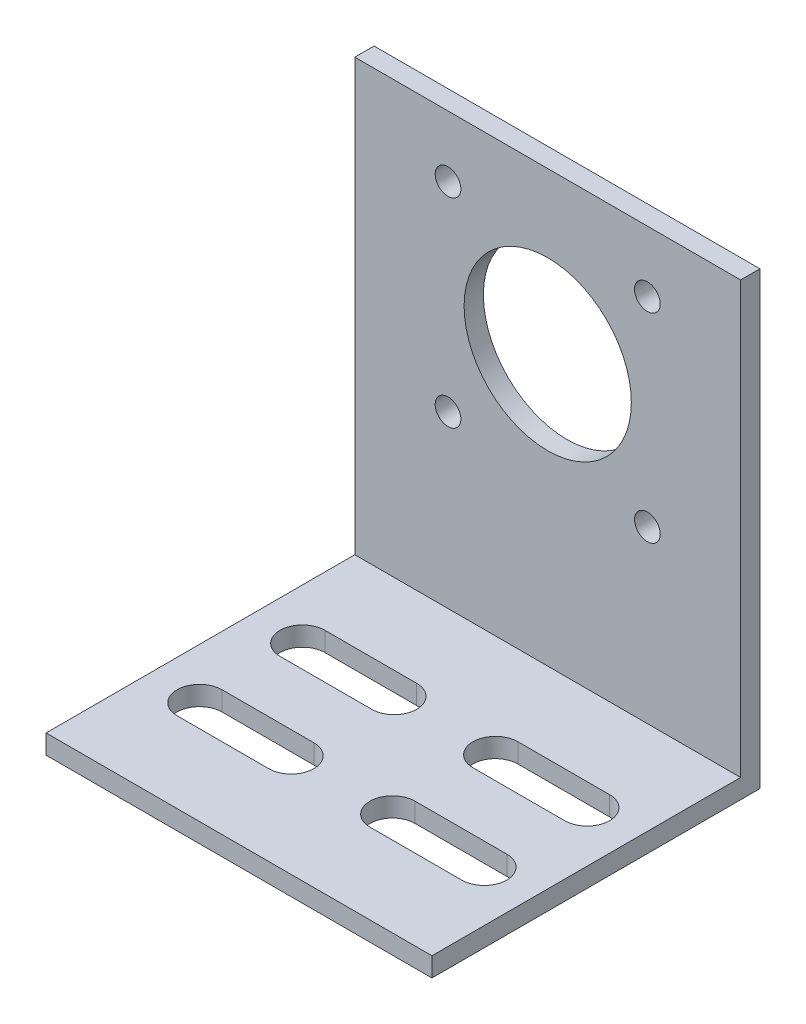
ISO-10303-21;
HEADER;
FILE_DESCRIPTION(('STEP AP214'),'2;1');
FILE_NAME('part.step','',(''),(''),'','','');
FILE_SCHEMA(('AUTOMOTIVE_DESIGN { 1 0 10303 214 1 1 1 1 }'));
ENDSEC;
DATA;
#1=APPLICATION_CONTEXT('core data for automotive mechanical design processes');
#2=APPLICATION_PROTOCOL_DEFINITION('international standard','automotive_design',2000,#1);
#3=PRODUCT_CONTEXT('',#1,'mechanical');
#4=PRODUCT('Part','Part','',(#3));
#5=PRODUCT_RELATED_PRODUCT_CATEGORY('part','',(#4));
#6=PRODUCT_DEFINITION_FORMATION('','',#4);
#7=PRODUCT_DEFINITION_CONTEXT('part definition',#1,'design');
#8=PRODUCT_DEFINITION('design','',#6,#7);
#9=PRODUCT_DEFINITION_SHAPE('','',#8);
#10=(LENGTH_UNIT() NAMED_UNIT(*) SI_UNIT(.MILLI.,.METRE.));
#11=(NAMED_UNIT(*) PLANE_ANGLE_UNIT() SI_UNIT($,.RADIAN.));
#12=(NAMED_UNIT(*) SI_UNIT($,.STERADIAN.) SOLID_ANGLE_UNIT());
#13=UNCERTAINTY_MEASURE_WITH_UNIT(LENGTH_MEASURE(1.E-05),#10,'distance_accuracy_value','');
#14=(GEOMETRIC_REPRESENTATION_CONTEXT(3) GLOBAL_UNCERTAINTY_ASSIGNED_CONTEXT((#13)) GLOBAL_UNIT_ASSIGNED_CONTEXT((#10,
#11,#12)) REPRESENTATION_CONTEXT('',''));
#15=CARTESIAN_POINT('',(0.,0.,0.));
#16=DIRECTION('',(0.,0.,1.));
#17=DIRECTION('',(1.,0.,0.));
#18=AXIS2_PLACEMENT_3D('',#15,#16,#17);
#19=CARTESIAN_POINT('',(-30.,-44.5,3.));
#20=DIRECTION('',(0.,1.,0.));
#21=DIRECTION('',(0.,0.,1.));
#22=AXIS2_PLACEMENT_3D('',#19,#20,#21);
#23=PLANE('',#22);
#24=DIRECTION('',(-1.,0.,0.));
#25=VECTOR('',#24,1.);
#26=CARTESIAN_POINT('',(-30.,-44.5,31.5));
#27=LINE('',#26,#25);
#28=CARTESIAN_POINT('',(22.1320374589651,-44.5,31.5));
#29=VERTEX_POINT('',#28);
#30=CARTESIAN_POINT('',(7.86796254103491,-44.5,31.5));
#31=VERTEX_POINT('',#30);
#32=EDGE_CURVE('E216',#29,#31,#27,.T.);
#33=ORIENTED_EDGE('',*,*,#32,.T.);
#34=CARTESIAN_POINT('',(7.86796254103491,-44.5,35.));
#35=DIRECTION('',(0.,1.,0.));
#36=DIRECTION('',(0.,0.,1.));
#37=AXIS2_PLACEMENT_3D('',#34,#35,#36);
#38=CIRCLE('',#37,3.5);
#39=CARTESIAN_POINT('',(7.86796254103491,-44.5,38.5));
#40=VERTEX_POINT('',#39);
#41=EDGE_CURVE('E219',#31,#40,#38,.T.);
#42=ORIENTED_EDGE('',*,*,#41,.T.);
#43=DIRECTION('',(1.,0.,0.));
#44=VECTOR('',#43,1.);
#45=CARTESIAN_POINT('',(-30.,-44.5,38.5));
#46=LINE('',#45,#44);
#47=CARTESIAN_POINT('',(22.1320374589651,-44.5,38.5));
#48=VERTEX_POINT('',#47);
#49=EDGE_CURVE('E211',#40,#48,#46,.T.);
#50=ORIENTED_EDGE('',*,*,#49,.T.);
#51=CARTESIAN_POINT('',(22.1320374589651,-44.5,35.));
#52=DIRECTION('',(0.,1.,0.));
#53=DIRECTION('',(0.,0.,1.));
#54=AXIS2_PLACEMENT_3D('',#51,#52,#53);
#55=CIRCLE('',#54,3.5);
#56=EDGE_CURVE('E191',#48,#29,#55,.T.);
#57=ORIENTED_EDGE('',*,*,#56,.T.);
#58=EDGE_LOOP('',(#33,#42,#50,#57));
#59=FACE_BOUND('',#58,.T.);
#60=CARTESIAN_POINT('',(-7.86796254103491,-44.5,35.));
#61=DIRECTION('',(0.,1.,0.));
#62=DIRECTION('',(0.,0.,1.));
#63=AXIS2_PLACEMENT_3D('',#60,#61,#62);
#64=CIRCLE('',#63,3.5);
#65=CARTESIAN_POINT('',(-7.86796254103491,-44.5,31.5));
#66=VERTEX_POINT('',#65);
#67=CARTESIAN_POINT('',(-7.86796254103491,-44.5,38.5));
#68=VERTEX_POINT('',#67);
#69=EDGE_CURVE('E280',#66,#68,#64,.F.);
#70=ORIENTED_EDGE('',*,*,#69,.F.);
#71=DIRECTION('',(1.,0.,0.));
#72=VECTOR('',#71,1.);
#73=CARTESIAN_POINT('',(-30.,-44.5,31.5));
#74=LINE('',#73,#72);
#75=CARTESIAN_POINT('',(-22.1320374589651,-44.5,31.5));
#76=VERTEX_POINT('',#75);
#77=EDGE_CURVE('E267',#76,#66,#74,.T.);
#78=ORIENTED_EDGE('',*,*,#77,.F.);
#79=CARTESIAN_POINT('',(-22.1320374589651,-44.5,35.));
#80=DIRECTION('',(0.,1.,0.));
#81=DIRECTION('',(0.,0.,1.));
#82=AXIS2_PLACEMENT_3D('',#79,#80,#81);
#83=CIRCLE('',#82,3.5);
#84=CARTESIAN_POINT('',(-22.1320374589651,-44.5,38.5));
#85=VERTEX_POINT('',#84);
#86=EDGE_CURVE('E275',#85,#76,#83,.F.);
#87=ORIENTED_EDGE('',*,*,#86,.F.);
#88=DIRECTION('',(-1.,0.,0.));
#89=VECTOR('',#88,1.);
#90=CARTESIAN_POINT('',(-30.,-44.5,38.5));
#91=LINE('',#90,#89);
#92=EDGE_CURVE('E278',#68,#85,#91,.T.);
#93=ORIENTED_EDGE('',*,*,#92,.F.);
#94=EDGE_LOOP('',(#70,#78,#87,#93));
#95=FACE_BOUND('',#94,.T.);
#96=DIRECTION('',(1.,0.,0.));
#97=VECTOR('',#96,1.);
#98=CARTESIAN_POINT('',(-30.,-44.5,22.5));
#99=LINE('',#98,#97);
#100=CARTESIAN_POINT('',(-22.1320374589651,-44.5,22.5));
#101=VERTEX_POINT('',#100);
#102=CARTESIAN_POINT('',(-7.86796254103491,-44.5,22.5));
#103=VERTEX_POINT('',#102);
#104=EDGE_CURVE('E308',#101,#103,#99,.T.);
#105=ORIENTED_EDGE('',*,*,#104,.T.);
#106=CARTESIAN_POINT('',(-7.86796254103491,-44.5,19.));
#107=DIRECTION('',(0.,1.,0.));
#108=DIRECTION('',(0.,0.,1.));
#109=AXIS2_PLACEMENT_3D('',#106,#107,#108);
#110=CIRCLE('',#109,3.5);
#111=CARTESIAN_POINT('',(-7.86796254103491,-44.5,15.5));
#112=VERTEX_POINT('',#111);
#113=EDGE_CURVE('E311',#103,#112,#110,.T.);
#114=ORIENTED_EDGE('',*,*,#113,.T.);
#115=DIRECTION('',(-1.,0.,0.));
#116=VECTOR('',#115,1.);
#117=CARTESIAN_POINT('',(-30.,-44.5,15.5));
#118=LINE('',#117,#116);
#119=CARTESIAN_POINT('',(-22.1320374589651,-44.5,15.5));
#120=VERTEX_POINT('',#119);
#121=EDGE_CURVE('E296',#112,#120,#118,.T.);
#122=ORIENTED_EDGE('',*,*,#121,.T.);
#123=CARTESIAN_POINT('',(-22.1320374589651,-44.5,19.));
#124=DIRECTION('',(0.,1.,0.));
#125=DIRECTION('',(0.,0.,1.));
#126=AXIS2_PLACEMENT_3D('',#123,#124,#125);
#127=CIRCLE('',#126,3.5);
#128=EDGE_CURVE('E305',#120,#101,#127,.T.);
#129=ORIENTED_EDGE('',*,*,#128,.T.);
#130=EDGE_LOOP('',(#105,#114,#122,#129));
#131=FACE_BOUND('',#130,.T.);
#132=DIRECTION('',(1.,0.,0.));
#133=VECTOR('',#132,1.);
#134=CARTESIAN_POINT('',(-30.,-44.5,0.));
#135=LINE('',#134,#133);
#136=CARTESIAN_POINT('',(-30.,-44.5,0.));
#137=VERTEX_POINT('',#136);
#138=CARTESIAN_POINT('',(30.,-44.5,0.));
#139=VERTEX_POINT('',#138);
#140=EDGE_CURVE('E359',#137,#139,#135,.T.);
#141=ORIENTED_EDGE('',*,*,#140,.T.);
#142=DIRECTION('',(0.,0.,-1.));
#143=VECTOR('',#142,1.);
#144=CARTESIAN_POINT('',(30.,-44.5,3.));
#145=LINE('',#144,#143);
#146=CARTESIAN_POINT('',(30.,-44.5,51.));
#147=VERTEX_POINT('',#146);
#148=EDGE_CURVE('E363',#147,#139,#145,.T.);
#149=ORIENTED_EDGE('',*,*,#148,.F.);
#150=DIRECTION('',(-1.,0.,0.));
#151=VECTOR('',#150,1.);
#152=CARTESIAN_POINT('',(-30.,-44.5,51.));
#153=LINE('',#152,#151);
#154=CARTESIAN_POINT('',(-30.,-44.5,51.));
#155=VERTEX_POINT('',#154);
#156=EDGE_CURVE('E333',#147,#155,#153,.T.);
#157=ORIENTED_EDGE('',*,*,#156,.T.);
#158=DIRECTION('',(0.,0.,-1.));
#159=VECTOR('',#158,1.);
#160=CARTESIAN_POINT('',(-30.,-44.5,3.));
#161=LINE('',#160,#159);
#162=EDGE_CURVE('E372',#155,#137,#161,.T.);
#163=ORIENTED_EDGE('',*,*,#162,.T.);
#164=EDGE_LOOP('',(#141,#149,#157,#163));
#165=FACE_BOUND('',#164,.T.);
#166=CARTESIAN_POINT('',(7.86796254103491,-44.5,19.));
#167=DIRECTION('',(0.,1.,0.));
#168=DIRECTION('',(0.,0.,1.));
#169=AXIS2_PLACEMENT_3D('',#166,#167,#168);
#170=CIRCLE('',#169,3.5);
#171=CARTESIAN_POINT('',(7.86796254103491,-44.5,22.5));
#172=VERTEX_POINT('',#171);
#173=CARTESIAN_POINT('',(7.86796254103491,-44.5,15.5));
#174=VERTEX_POINT('',#173);
#175=EDGE_CURVE('E250',#172,#174,#170,.F.);
#176=ORIENTED_EDGE('',*,*,#175,.F.);
#177=DIRECTION('',(-1.,0.,0.));
#178=VECTOR('',#177,1.);
#179=CARTESIAN_POINT('',(-30.,-44.5,22.5));
#180=LINE('',#179,#178);
#181=CARTESIAN_POINT('',(22.1320374589651,-44.5,22.5));
#182=VERTEX_POINT('',#181);
#183=EDGE_CURVE('E237',#182,#172,#180,.T.);
#184=ORIENTED_EDGE('',*,*,#183,.F.);
#185=CARTESIAN_POINT('',(22.1320374589651,-44.5,19.));
#186=DIRECTION('',(0.,1.,0.));
#187=DIRECTION('',(0.,0.,1.));
#188=AXIS2_PLACEMENT_3D('',#185,#186,#187);
#189=CIRCLE('',#188,3.5);
#190=CARTESIAN_POINT('',(22.1320374589651,-44.5,15.5));
#191=VERTEX_POINT('',#190);
#192=EDGE_CURVE('E245',#191,#182,#189,.F.);
#193=ORIENTED_EDGE('',*,*,#192,.F.);
#194=DIRECTION('',(1.,0.,0.));
#195=VECTOR('',#194,1.);
#196=CARTESIAN_POINT('',(-30.,-44.5,15.5));
#197=LINE('',#196,#195);
#198=EDGE_CURVE('E248',#174,#191,#197,.T.);
#199=ORIENTED_EDGE('',*,*,#198,.F.);
#200=EDGE_LOOP('',(#176,#184,#193,#199));
#201=FACE_BOUND('',#200,.T.);
#202=ADVANCED_FACE('F34',(#59,#95,#131,#165,#201),#23,.F.);
#203=CARTESIAN_POINT('',(0.,-41.5,0.));
#204=DIRECTION('',(0.,1.,0.));
#205=DIRECTION('',(0.,0.,1.));
#206=AXIS2_PLACEMENT_3D('',#203,#204,#205);
#207=PLANE('',#206);
#208=CARTESIAN_POINT('',(7.86796254103491,-41.5,35.));
#209=DIRECTION('',(0.,1.,0.));
#210=DIRECTION('',(0.,0.,-1.));
#211=AXIS2_PLACEMENT_3D('',#208,#209,#210);
#212=CIRCLE('',#211,3.5);
#213=CARTESIAN_POINT('',(7.86796254103491,-41.5,31.5));
#214=VERTEX_POINT('',#213);
#215=CARTESIAN_POINT('',(7.86796254103491,-41.5,38.5));
#216=VERTEX_POINT('',#215);
#217=EDGE_CURVE('E59',#214,#216,#212,.T.);
#218=ORIENTED_EDGE('',*,*,#217,.F.);
#219=DIRECTION('',(-1.,0.,0.));
#220=VECTOR('',#219,1.);
#221=CARTESIAN_POINT('',(22.1320374589651,-41.5,31.5));
#222=LINE('',#221,#220);
#223=CARTESIAN_POINT('',(22.1320374589651,-41.5,31.5));
#224=VERTEX_POINT('',#223);
#225=EDGE_CURVE('E204',#224,#214,#222,.T.);
#226=ORIENTED_EDGE('',*,*,#225,.F.);
#227=CARTESIAN_POINT('',(22.1320374589651,-41.5,35.));
#228=DIRECTION('',(0.,1.,0.));
#229=DIRECTION('',(0.,0.,-1.));
#230=AXIS2_PLACEMENT_3D('',#227,#228,#229);
#231=CIRCLE('',#230,3.5);
#232=CARTESIAN_POINT('',(22.1320374589651,-41.5,38.5));
#233=VERTEX_POINT('',#232);
#234=EDGE_CURVE('E188',#233,#224,#231,.T.);
#235=ORIENTED_EDGE('',*,*,#234,.F.);
#236=DIRECTION('',(1.,0.,0.));
#237=VECTOR('',#236,1.);
#238=CARTESIAN_POINT('',(22.1320374589651,-41.5,38.5));
#239=LINE('',#238,#237);
#240=EDGE_CURVE('E197',#216,#233,#239,.T.);
#241=ORIENTED_EDGE('',*,*,#240,.F.);
#242=EDGE_LOOP('',(#218,#226,#235,#241));
#243=FACE_BOUND('',#242,.T.);
#244=CARTESIAN_POINT('',(-7.86796254103491,-41.5,19.));
#245=DIRECTION('',(0.,1.,0.));
#246=DIRECTION('',(0.,0.,1.));
#247=AXIS2_PLACEMENT_3D('',#244,#245,#246);
#248=CIRCLE('',#247,3.5);
#249=CARTESIAN_POINT('',(-7.86796254103491,-41.5,22.5));
#250=VERTEX_POINT('',#249);
#251=CARTESIAN_POINT('',(-7.86796254103491,-41.5,15.5));
#252=VERTEX_POINT('',#251);
#253=EDGE_CURVE('E282',#250,#252,#248,.T.);
#254=ORIENTED_EDGE('',*,*,#253,.F.);
#255=DIRECTION('',(1.,0.,0.));
#256=VECTOR('',#255,1.);
#257=CARTESIAN_POINT('',(-22.1320374589651,-41.5,22.5));
#258=LINE('',#257,#256);
#259=CARTESIAN_POINT('',(-22.1320374589651,-41.5,22.5));
#260=VERTEX_POINT('',#259);
#261=EDGE_CURVE('E290',#260,#250,#258,.T.);
#262=ORIENTED_EDGE('',*,*,#261,.F.);
#263=CARTESIAN_POINT('',(-22.1320374589651,-41.5,19.));
#264=DIRECTION('',(0.,1.,0.));
#265=DIRECTION('',(0.,0.,1.));
#266=AXIS2_PLACEMENT_3D('',#263,#264,#265);
#267=CIRCLE('',#266,3.5);
#268=CARTESIAN_POINT('',(-22.1320374589651,-41.5,15.5));
#269=VERTEX_POINT('',#268);
#270=EDGE_CURVE('E287',#269,#260,#267,.T.);
#271=ORIENTED_EDGE('',*,*,#270,.F.);
#272=DIRECTION('',(-1.,0.,0.));
#273=VECTOR('',#272,1.);
#274=CARTESIAN_POINT('',(-22.1320374589651,-41.5,15.5));
#275=LINE('',#274,#273);
#276=EDGE_CURVE('E284',#252,#269,#275,.T.);
#277=ORIENTED_EDGE('',*,*,#276,.F.);
#278=EDGE_LOOP('',(#254,#262,#271,#277));
#279=FACE_BOUND('',#278,.T.);
#280=DIRECTION('',(0.,0.,1.));
#281=VECTOR('',#280,1.);
#282=CARTESIAN_POINT('',(30.,-41.5,0.));
#283=LINE('',#282,#281);
#284=CARTESIAN_POINT('',(30.,-41.5,3.));
#285=VERTEX_POINT('',#284);
#286=CARTESIAN_POINT('',(30.,-41.5,51.));
#287=VERTEX_POINT('',#286);
#288=EDGE_CURVE('E332',#285,#287,#283,.T.);
#289=ORIENTED_EDGE('',*,*,#288,.F.);
#290=DIRECTION('',(-1.,0.,0.));
#291=VECTOR('',#290,1.);
#292=CARTESIAN_POINT('',(0.,-41.5,3.));
#293=LINE('',#292,#291);
#294=CARTESIAN_POINT('',(-30.,-41.5,3.));
#295=VERTEX_POINT('',#294);
#296=EDGE_CURVE('E344',#285,#295,#293,.T.);
#297=ORIENTED_EDGE('',*,*,#296,.T.);
#298=DIRECTION('',(0.,0.,-1.));
#299=VECTOR('',#298,1.);
#300=CARTESIAN_POINT('',(-30.,-41.5,0.));
#301=LINE('',#300,#299);
#302=CARTESIAN_POINT('',(-30.,-41.5,51.));
#303=VERTEX_POINT('',#302);
#304=EDGE_CURVE('E329',#303,#295,#301,.T.);
#305=ORIENTED_EDGE('',*,*,#304,.F.);
#306=DIRECTION('',(-1.,0.,0.));
#307=VECTOR('',#306,1.);
#308=CARTESIAN_POINT('',(-30.,-41.5,51.));
#309=LINE('',#308,#307);
#310=EDGE_CURVE('E335',#287,#303,#309,.T.);
#311=ORIENTED_EDGE('',*,*,#310,.F.);
#312=EDGE_LOOP('',(#289,#297,#305,#311));
#313=FACE_BOUND('',#312,.T.);
#314=DIRECTION('',(1.,0.,0.));
#315=VECTOR('',#314,1.);
#316=CARTESIAN_POINT('',(-22.1320374589651,-41.5,31.5));
#317=LINE('',#316,#315);
#318=CARTESIAN_POINT('',(-22.1320374589651,-41.5,31.5));
#319=VERTEX_POINT('',#318);
#320=CARTESIAN_POINT('',(-7.86796254103491,-41.5,31.5));
#321=VERTEX_POINT('',#320);
#322=EDGE_CURVE('E255',#319,#321,#317,.T.);
#323=ORIENTED_EDGE('',*,*,#322,.T.);
#324=CARTESIAN_POINT('',(-7.86796254103491,-41.5,35.));
#325=DIRECTION('',(0.,-1.,0.));
#326=DIRECTION('',(0.,0.,-1.));
#327=AXIS2_PLACEMENT_3D('',#324,#325,#326);
#328=CIRCLE('',#327,3.5);
#329=CARTESIAN_POINT('',(-7.86796254103491,-41.5,38.5));
#330=VERTEX_POINT('',#329);
#331=EDGE_CURVE('E252',#321,#330,#328,.T.);
#332=ORIENTED_EDGE('',*,*,#331,.T.);
#333=DIRECTION('',(-1.,0.,0.));
#334=VECTOR('',#333,1.);
#335=CARTESIAN_POINT('',(-22.1320374589651,-41.5,38.5));
#336=LINE('',#335,#334);
#337=CARTESIAN_POINT('',(-22.1320374589651,-41.5,38.5));
#338=VERTEX_POINT('',#337);
#339=EDGE_CURVE('E261',#330,#338,#336,.T.);
#340=ORIENTED_EDGE('',*,*,#339,.T.);
#341=CARTESIAN_POINT('',(-22.1320374589651,-41.5,35.));
#342=DIRECTION('',(0.,-1.,0.));
#343=DIRECTION('',(0.,0.,-1.));
#344=AXIS2_PLACEMENT_3D('',#341,#342,#343);
#345=CIRCLE('',#344,3.5);
#346=EDGE_CURVE('E258',#338,#319,#345,.T.);
#347=ORIENTED_EDGE('',*,*,#346,.T.);
#348=EDGE_LOOP('',(#323,#332,#340,#347));
#349=FACE_BOUND('',#348,.T.);
#350=DIRECTION('',(-1.,0.,0.));
#351=VECTOR('',#350,1.);
#352=CARTESIAN_POINT('',(22.1320374589651,-41.5,22.5));
#353=LINE('',#352,#351);
#354=CARTESIAN_POINT('',(22.1320374589651,-41.5,22.5));
#355=VERTEX_POINT('',#354);
#356=CARTESIAN_POINT('',(7.86796254103491,-41.5,22.5));
#357=VERTEX_POINT('',#356);
#358=EDGE_CURVE('E225',#355,#357,#353,.T.);
#359=ORIENTED_EDGE('',*,*,#358,.T.);
#360=CARTESIAN_POINT('',(7.86796254103491,-41.5,19.));
#361=DIRECTION('',(0.,-1.,0.));
#362=DIRECTION('',(0.,0.,1.));
#363=AXIS2_PLACEMENT_3D('',#360,#361,#362);
#364=CIRCLE('',#363,3.5);
#365=CARTESIAN_POINT('',(7.86796254103491,-41.5,15.5));
#366=VERTEX_POINT('',#365);
#367=EDGE_CURVE('E222',#357,#366,#364,.T.);
#368=ORIENTED_EDGE('',*,*,#367,.T.);
#369=DIRECTION('',(1.,0.,0.));
#370=VECTOR('',#369,1.);
#371=CARTESIAN_POINT('',(22.1320374589651,-41.5,15.5));
#372=LINE('',#371,#370);
#373=CARTESIAN_POINT('',(22.1320374589651,-41.5,15.5));
#374=VERTEX_POINT('',#373);
#375=EDGE_CURVE('E231',#366,#374,#372,.T.);
#376=ORIENTED_EDGE('',*,*,#375,.T.);
#377=CARTESIAN_POINT('',(22.1320374589651,-41.5,19.));
#378=DIRECTION('',(0.,-1.,0.));
#379=DIRECTION('',(0.,0.,1.));
#380=AXIS2_PLACEMENT_3D('',#377,#378,#379);
#381=CIRCLE('',#380,3.5);
#382=EDGE_CURVE('E228',#374,#355,#381,.T.);
#383=ORIENTED_EDGE('',*,*,#382,.T.);
#384=EDGE_LOOP('',(#359,#368,#376,#383));
#385=FACE_BOUND('',#384,.T.);
#386=ADVANCED_FACE('F201',(#243,#279,#313,#349,#385),#207,.T.);
#387=CARTESIAN_POINT('',(0.,0.,3.));
#388=DIRECTION('',(0.,0.,1.));
#389=DIRECTION('',(1.,0.,0.));
#390=AXIS2_PLACEMENT_3D('',#387,#388,#389);
#391=PLANE('',#390);
#392=CARTESIAN_POINT('',(15.5,-15.,3.));
#393=DIRECTION('',(0.,0.,1.));
#394=DIRECTION('',(-1.,0.,0.));
#395=AXIS2_PLACEMENT_3D('',#392,#393,#394);
#396=CIRCLE('',#395,2.);
#397=CARTESIAN_POINT('',(13.5,-15.,3.));
#398=VERTEX_POINT('',#397);
#399=EDGE_CURVE('E314',#398,#398,#396,.T.);
#400=ORIENTED_EDGE('',*,*,#399,.F.);
#401=EDGE_LOOP('',(#400));
#402=FACE_BOUND('',#401,.T.);
#403=CARTESIAN_POINT('',(-15.5,-15.,3.));
#404=DIRECTION('',(0.,0.,-1.));
#405=DIRECTION('',(1.,0.,0.));
#406=AXIS2_PLACEMENT_3D('',#403,#404,#405);
#407=CIRCLE('',#406,2.);
#408=CARTESIAN_POINT('',(-13.5,-15.,3.));
#409=VERTEX_POINT('',#408);
#410=EDGE_CURVE('E317',#409,#409,#407,.T.);
#411=ORIENTED_EDGE('',*,*,#410,.T.);
#412=EDGE_LOOP('',(#411));
#413=FACE_BOUND('',#412,.T.);
#414=CARTESIAN_POINT('',(15.5,16.,3.));
#415=DIRECTION('',(0.,0.,-1.));
#416=DIRECTION('',(-1.,0.,0.));
#417=AXIS2_PLACEMENT_3D('',#414,#415,#416);
#418=CIRCLE('',#417,2.);
#419=CARTESIAN_POINT('',(13.5,16.,3.));
#420=VERTEX_POINT('',#419);
#421=EDGE_CURVE('E321',#420,#420,#418,.T.);
#422=ORIENTED_EDGE('',*,*,#421,.T.);
#423=EDGE_LOOP('',(#422));
#424=FACE_BOUND('',#423,.T.);
#425=CARTESIAN_POINT('',(-15.5,16.,3.));
#426=DIRECTION('',(0.,0.,1.));
#427=DIRECTION('',(1.,0.,0.));
#428=AXIS2_PLACEMENT_3D('',#425,#426,#427);
#429=CIRCLE('',#428,2.);
#430=CARTESIAN_POINT('',(-13.5,16.,3.));
#431=VERTEX_POINT('',#430);
#432=EDGE_CURVE('E325',#431,#431,#429,.T.);
#433=ORIENTED_EDGE('',*,*,#432,.F.);
#434=EDGE_LOOP('',(#433));
#435=FACE_BOUND('',#434,.T.);
#436=ORIENTED_EDGE('',*,*,#296,.F.);
#437=DIRECTION('',(0.,1.,0.));
#438=VECTOR('',#437,1.);
#439=CARTESIAN_POINT('',(30.,25.5,3.));
#440=LINE('',#439,#438);
#441=CARTESIAN_POINT('',(30.,25.5,3.));
#442=VERTEX_POINT('',#441);
#443=EDGE_CURVE('E356',#285,#442,#440,.T.);
#444=ORIENTED_EDGE('',*,*,#443,.T.);
#445=DIRECTION('',(-1.,0.,0.));
#446=VECTOR('',#445,1.);
#447=CARTESIAN_POINT('',(-30.,25.5,3.));
#448=LINE('',#447,#446);
#449=CARTESIAN_POINT('',(-30.,25.5,3.));
#450=VERTEX_POINT('',#449);
#451=EDGE_CURVE('E358',#442,#450,#448,.T.);
#452=ORIENTED_EDGE('',*,*,#451,.T.);
#453=DIRECTION('',(0.,-1.,0.));
#454=VECTOR('',#453,1.);
#455=CARTESIAN_POINT('',(-30.,25.5,3.));
#456=LINE('',#455,#454);
#457=EDGE_CURVE('E361',#450,#295,#456,.T.);
#458=ORIENTED_EDGE('',*,*,#457,.T.);
#459=EDGE_LOOP('',(#436,#444,#452,#458));
#460=FACE_BOUND('',#459,.T.);
#461=CARTESIAN_POINT('',(0.,0.499999999999994,3.));
#462=DIRECTION('',(0.,0.,1.));
#463=DIRECTION('',(1.,0.,0.));
#464=AXIS2_PLACEMENT_3D('',#461,#462,#463);
#465=CIRCLE('',#464,13.);
#466=CARTESIAN_POINT('',(13.,0.499999999999994,3.));
#467=VERTEX_POINT('',#466);
#468=EDGE_CURVE('E350',#467,#467,#465,.T.);
#469=ORIENTED_EDGE('',*,*,#468,.F.);
#470=EDGE_LOOP('',(#469));
#471=FACE_BOUND('',#470,.T.);
#472=ADVANCED_FACE('F388',(#402,#413,#424,#435,#460,#471),#391,.T.);
#473=CARTESIAN_POINT('',(0.,0.,0.));
#474=DIRECTION('',(0.,0.,1.));
#475=DIRECTION('',(1.,0.,0.));
#476=AXIS2_PLACEMENT_3D('',#473,#474,#475);
#477=PLANE('',#476);
#478=CARTESIAN_POINT('',(15.5,-15.,0.));
#479=DIRECTION('',(0.,0.,1.));
#480=DIRECTION('',(1.,0.,0.));
#481=AXIS2_PLACEMENT_3D('',#478,#479,#480);
#482=CIRCLE('',#481,2.);
#483=CARTESIAN_POINT('',(17.5,-15.,0.));
#484=VERTEX_POINT('',#483);
#485=EDGE_CURVE('E38',#484,#484,#482,.T.);
#486=ORIENTED_EDGE('',*,*,#485,.T.);
#487=EDGE_LOOP('',(#486));
#488=FACE_BOUND('',#487,.T.);
#489=CARTESIAN_POINT('',(-15.5,-15.,0.));
#490=DIRECTION('',(0.,0.,1.));
#491=DIRECTION('',(1.,0.,0.));
#492=AXIS2_PLACEMENT_3D('',#489,#490,#491);
#493=CIRCLE('',#492,2.);
#494=CARTESIAN_POINT('',(-13.5,-15.,0.));
#495=VERTEX_POINT('',#494);
#496=EDGE_CURVE('E320',#495,#495,#493,.F.);
#497=ORIENTED_EDGE('',*,*,#496,.F.);
#498=EDGE_LOOP('',(#497));
#499=FACE_BOUND('',#498,.T.);
#500=CARTESIAN_POINT('',(15.5,16.,0.));
#501=DIRECTION('',(0.,0.,1.));
#502=DIRECTION('',(1.,0.,0.));
#503=AXIS2_PLACEMENT_3D('',#500,#501,#502);
#504=CIRCLE('',#503,2.);
#505=CARTESIAN_POINT('',(17.5,16.,0.));
#506=VERTEX_POINT('',#505);
#507=EDGE_CURVE('E324',#506,#506,#504,.F.);
#508=ORIENTED_EDGE('',*,*,#507,.F.);
#509=EDGE_LOOP('',(#508));
#510=FACE_BOUND('',#509,.T.);
#511=CARTESIAN_POINT('',(-15.5,16.,0.));
#512=DIRECTION('',(0.,0.,1.));
#513=DIRECTION('',(1.,0.,0.));
#514=AXIS2_PLACEMENT_3D('',#511,#512,#513);
#515=CIRCLE('',#514,2.);
#516=CARTESIAN_POINT('',(-13.5,16.,0.));
#517=VERTEX_POINT('',#516);
#518=EDGE_CURVE('E328',#517,#517,#515,.T.);
#519=ORIENTED_EDGE('',*,*,#518,.T.);
#520=EDGE_LOOP('',(#519));
#521=FACE_BOUND('',#520,.T.);
#522=DIRECTION('',(-1.,0.,0.));
#523=VECTOR('',#522,1.);
#524=CARTESIAN_POINT('',(-30.,25.5,0.));
#525=LINE('',#524,#523);
#526=CARTESIAN_POINT('',(30.,25.5,0.));
#527=VERTEX_POINT('',#526);
#528=CARTESIAN_POINT('',(-30.,25.5,0.));
#529=VERTEX_POINT('',#528);
#530=EDGE_CURVE('E365',#527,#529,#525,.T.);
#531=ORIENTED_EDGE('',*,*,#530,.F.);
#532=DIRECTION('',(0.,1.,0.));
#533=VECTOR('',#532,1.);
#534=CARTESIAN_POINT('',(30.,25.5,0.));
#535=LINE('',#534,#533);
#536=EDGE_CURVE('E353',#139,#527,#535,.T.);
#537=ORIENTED_EDGE('',*,*,#536,.F.);
#538=ORIENTED_EDGE('',*,*,#140,.F.);
#539=DIRECTION('',(0.,-1.,0.));
#540=VECTOR('',#539,1.);
#541=CARTESIAN_POINT('',(-30.,25.5,0.));
#542=LINE('',#541,#540);
#543=EDGE_CURVE('E367',#529,#137,#542,.T.);
#544=ORIENTED_EDGE('',*,*,#543,.F.);
#545=EDGE_LOOP('',(#531,#537,#538,#544));
#546=FACE_BOUND('',#545,.T.);
#547=CARTESIAN_POINT('',(0.,0.499999999999994,0.));
#548=DIRECTION('',(0.,0.,1.));
#549=DIRECTION('',(1.,0.,0.));
#550=AXIS2_PLACEMENT_3D('',#547,#548,#549);
#551=CIRCLE('',#550,13.);
#552=CARTESIAN_POINT('',(13.,0.499999999999994,0.));
#553=VERTEX_POINT('',#552);
#554=EDGE_CURVE('E349',#553,#553,#551,.T.);
#555=ORIENTED_EDGE('',*,*,#554,.T.);
#556=EDGE_LOOP('',(#555));
#557=FACE_BOUND('',#556,.T.);
#558=ADVANCED_FACE('F385',(#488,#499,#510,#521,#546,#557),#477,.F.);
#559=CARTESIAN_POINT('',(30.,25.5,3.));
#560=DIRECTION('',(-1.,0.,0.));
#561=DIRECTION('',(0.,-1.,0.));
#562=AXIS2_PLACEMENT_3D('',#559,#560,#561);
#563=PLANE('',#562);
#564=ORIENTED_EDGE('',*,*,#443,.F.);
#565=ORIENTED_EDGE('',*,*,#288,.T.);
#566=DIRECTION('',(0.,-1.,0.));
#567=VECTOR('',#566,1.);
#568=CARTESIAN_POINT('',(30.,-41.5,51.));
#569=LINE('',#568,#567);
#570=EDGE_CURVE('E338',#287,#147,#569,.T.);
#571=ORIENTED_EDGE('',*,*,#570,.T.);
#572=ORIENTED_EDGE('',*,*,#148,.T.);
#573=ORIENTED_EDGE('',*,*,#536,.T.);
#574=DIRECTION('',(0.,0.,-1.));
#575=VECTOR('',#574,1.);
#576=CARTESIAN_POINT('',(30.,25.5,3.));
#577=LINE('',#576,#575);
#578=EDGE_CURVE('E11',#442,#527,#577,.T.);
#579=ORIENTED_EDGE('',*,*,#578,.F.);
#580=EDGE_LOOP('',(#564,#565,#571,#572,#573,#579));
#581=FACE_BOUND('',#580,.T.);
#582=ADVANCED_FACE('F36',(#581),#563,.F.);
#583=CARTESIAN_POINT('',(-30.,25.5,3.));
#584=DIRECTION('',(0.,-1.,0.));
#585=DIRECTION('',(0.,0.,-1.));
#586=AXIS2_PLACEMENT_3D('',#583,#584,#585);
#587=PLANE('',#586);
#588=ORIENTED_EDGE('',*,*,#530,.T.);
#589=DIRECTION('',(0.,0.,-1.));
#590=VECTOR('',#589,1.);
#591=CARTESIAN_POINT('',(-30.,25.5,3.));
#592=LINE('',#591,#590);
#593=EDGE_CURVE('E43',#450,#529,#592,.T.);
#594=ORIENTED_EDGE('',*,*,#593,.F.);
#595=ORIENTED_EDGE('',*,*,#451,.F.);
#596=ORIENTED_EDGE('',*,*,#578,.T.);
#597=EDGE_LOOP('',(#588,#594,#595,#596));
#598=FACE_BOUND('',#597,.T.);
#599=ADVANCED_FACE('F414',(#598),#587,.F.);
#600=CARTESIAN_POINT('',(-30.,25.5,3.));
#601=DIRECTION('',(1.,0.,0.));
#602=DIRECTION('',(0.,1.,0.));
#603=AXIS2_PLACEMENT_3D('',#600,#601,#602);
#604=PLANE('',#603);
#605=ORIENTED_EDGE('',*,*,#543,.T.);
#606=ORIENTED_EDGE('',*,*,#162,.F.);
#607=DIRECTION('',(0.,-1.,0.));
#608=VECTOR('',#607,1.);
#609=CARTESIAN_POINT('',(-30.,-41.5,51.));
#610=LINE('',#609,#608);
#611=EDGE_CURVE('E341',#303,#155,#610,.T.);
#612=ORIENTED_EDGE('',*,*,#611,.F.);
#613=ORIENTED_EDGE('',*,*,#304,.T.);
#614=ORIENTED_EDGE('',*,*,#457,.F.);
#615=ORIENTED_EDGE('',*,*,#593,.T.);
#616=EDGE_LOOP('',(#605,#606,#612,#613,#614,#615));
#617=FACE_BOUND('',#616,.T.);
#618=ADVANCED_FACE('F404',(#617),#604,.F.);
#619=CARTESIAN_POINT('',(0.,0.499999999999994,3.));
#620=DIRECTION('',(0.,0.,-1.));
#621=DIRECTION('',(-1.,0.,0.));
#622=AXIS2_PLACEMENT_3D('',#619,#620,#621);
#623=CYLINDRICAL_SURFACE('',#622,13.);
#624=ORIENTED_EDGE('',*,*,#468,.T.);
#625=EDGE_LOOP('',(#624));
#626=FACE_BOUND('',#625,.T.);
#627=ORIENTED_EDGE('',*,*,#554,.F.);
#628=EDGE_LOOP('',(#627));
#629=FACE_BOUND('',#628,.T.);
#630=ADVANCED_FACE('F401',(#626,#629),#623,.F.);
#631=CARTESIAN_POINT('',(-30.,-41.5,51.));
#632=DIRECTION('',(0.,0.,1.));
#633=DIRECTION('',(1.,0.,0.));
#634=AXIS2_PLACEMENT_3D('',#631,#632,#633);
#635=PLANE('',#634);
#636=ORIENTED_EDGE('',*,*,#156,.F.);
#637=ORIENTED_EDGE('',*,*,#570,.F.);
#638=ORIENTED_EDGE('',*,*,#310,.T.);
#639=ORIENTED_EDGE('',*,*,#611,.T.);
#640=EDGE_LOOP('',(#636,#637,#638,#639));
#641=FACE_BOUND('',#640,.T.);
#642=ADVANCED_FACE('F403',(#641),#635,.T.);
#643=CARTESIAN_POINT('',(-15.5,16.,-7.));
#644=DIRECTION('',(0.,0.,1.));
#645=DIRECTION('',(1.,0.,0.));
#646=AXIS2_PLACEMENT_3D('',#643,#644,#645);
#647=CYLINDRICAL_SURFACE('',#646,2.);
#648=ORIENTED_EDGE('',*,*,#432,.T.);
#649=EDGE_LOOP('',(#648));
#650=FACE_BOUND('',#649,.T.);
#651=ORIENTED_EDGE('',*,*,#518,.F.);
#652=EDGE_LOOP('',(#651));
#653=FACE_BOUND('',#652,.T.);
#654=ADVANCED_FACE('F411',(#650,#653),#647,.F.);
#655=CARTESIAN_POINT('',(15.5,16.,-7.));
#656=DIRECTION('',(0.,0.,1.));
#657=DIRECTION('',(1.,0.,0.));
#658=AXIS2_PLACEMENT_3D('',#655,#656,#657);
#659=CYLINDRICAL_SURFACE('',#658,2.);
#660=ORIENTED_EDGE('',*,*,#421,.F.);
#661=EDGE_LOOP('',(#660));
#662=FACE_BOUND('',#661,.T.);
#663=ORIENTED_EDGE('',*,*,#507,.T.);
#664=EDGE_LOOP('',(#663));
#665=FACE_BOUND('',#664,.T.);
#666=ADVANCED_FACE('F464',(#662,#665),#659,.F.);
#667=CARTESIAN_POINT('',(-15.5,-15.,-7.));
#668=DIRECTION('',(0.,0.,1.));
#669=DIRECTION('',(1.,0.,0.));
#670=AXIS2_PLACEMENT_3D('',#667,#668,#669);
#671=CYLINDRICAL_SURFACE('',#670,2.);
#672=ORIENTED_EDGE('',*,*,#410,.F.);
#673=EDGE_LOOP('',(#672));
#674=FACE_BOUND('',#673,.T.);
#675=ORIENTED_EDGE('',*,*,#496,.T.);
#676=EDGE_LOOP('',(#675));
#677=FACE_BOUND('',#676,.T.);
#678=ADVANCED_FACE('F383',(#674,#677),#671,.F.);
#679=CARTESIAN_POINT('',(15.5,-15.,-7.));
#680=DIRECTION('',(0.,0.,1.));
#681=DIRECTION('',(1.,0.,0.));
#682=AXIS2_PLACEMENT_3D('',#679,#680,#681);
#683=CYLINDRICAL_SURFACE('',#682,2.);
#684=ORIENTED_EDGE('',*,*,#399,.T.);
#685=EDGE_LOOP('',(#684));
#686=FACE_BOUND('',#685,.T.);
#687=ORIENTED_EDGE('',*,*,#485,.F.);
#688=EDGE_LOOP('',(#687));
#689=FACE_BOUND('',#688,.T.);
#690=ADVANCED_FACE('F474',(#686,#689),#683,.F.);
#691=CARTESIAN_POINT('',(-7.86796254103491,-51.5,19.));
#692=DIRECTION('',(0.,1.,0.));
#693=DIRECTION('',(0.,0.,1.));
#694=AXIS2_PLACEMENT_3D('',#691,#692,#693);
#695=CYLINDRICAL_SURFACE('',#694,3.5);
#696=DIRECTION('',(0.,1.,0.));
#697=VECTOR('',#696,1.);
#698=CARTESIAN_POINT('',(-7.86796254103491,-51.5,22.5));
#699=LINE('',#698,#697);
#700=EDGE_CURVE('E294',#103,#250,#699,.T.);
#701=ORIENTED_EDGE('',*,*,#700,.T.);
#702=ORIENTED_EDGE('',*,*,#253,.T.);
#703=DIRECTION('',(0.,1.,0.));
#704=VECTOR('',#703,1.);
#705=CARTESIAN_POINT('',(-7.86796254103491,-51.5,15.5));
#706=LINE('',#705,#704);
#707=EDGE_CURVE('E293',#112,#252,#706,.T.);
#708=ORIENTED_EDGE('',*,*,#707,.F.);
#709=ORIENTED_EDGE('',*,*,#113,.F.);
#710=EDGE_LOOP('',(#701,#702,#708,#709));
#711=FACE_BOUND('',#710,.T.);
#712=ADVANCED_FACE('F478',(#711),#695,.F.);
#713=CARTESIAN_POINT('',(-22.1320374589651,-51.5,22.5));
#714=DIRECTION('',(0.,0.,1.));
#715=DIRECTION('',(1.,0.,0.));
#716=AXIS2_PLACEMENT_3D('',#713,#714,#715);
#717=PLANE('',#716);
#718=DIRECTION('',(0.,1.,0.));
#719=VECTOR('',#718,1.);
#720=CARTESIAN_POINT('',(-22.1320374589651,-51.5,22.5));
#721=LINE('',#720,#719);
#722=EDGE_CURVE('E297',#101,#260,#721,.T.);
#723=ORIENTED_EDGE('',*,*,#722,.T.);
#724=ORIENTED_EDGE('',*,*,#261,.T.);
#725=ORIENTED_EDGE('',*,*,#700,.F.);
#726=ORIENTED_EDGE('',*,*,#104,.F.);
#727=EDGE_LOOP('',(#723,#724,#725,#726));
#728=FACE_BOUND('',#727,.T.);
#729=ADVANCED_FACE('F482',(#728),#717,.F.);
#730=CARTESIAN_POINT('',(-22.1320374589651,-51.5,19.));
#731=DIRECTION('',(0.,1.,0.));
#732=DIRECTION('',(0.,0.,1.));
#733=AXIS2_PLACEMENT_3D('',#730,#731,#732);
#734=CYLINDRICAL_SURFACE('',#733,3.5);
#735=DIRECTION('',(0.,1.,0.));
#736=VECTOR('',#735,1.);
#737=CARTESIAN_POINT('',(-22.1320374589651,-51.5,15.5));
#738=LINE('',#737,#736);
#739=EDGE_CURVE('E299',#120,#269,#738,.T.);
#740=ORIENTED_EDGE('',*,*,#739,.T.);
#741=ORIENTED_EDGE('',*,*,#270,.T.);
#742=ORIENTED_EDGE('',*,*,#722,.F.);
#743=ORIENTED_EDGE('',*,*,#128,.F.);
#744=EDGE_LOOP('',(#740,#741,#742,#743));
#745=FACE_BOUND('',#744,.T.);
#746=ADVANCED_FACE('F488',(#745),#734,.F.);
#747=CARTESIAN_POINT('',(-22.1320374589651,-51.5,15.5));
#748=DIRECTION('',(0.,0.,-1.));
#749=DIRECTION('',(-1.,0.,0.));
#750=AXIS2_PLACEMENT_3D('',#747,#748,#749);
#751=PLANE('',#750);
#752=ORIENTED_EDGE('',*,*,#707,.T.);
#753=ORIENTED_EDGE('',*,*,#276,.T.);
#754=ORIENTED_EDGE('',*,*,#739,.F.);
#755=ORIENTED_EDGE('',*,*,#121,.F.);
#756=EDGE_LOOP('',(#752,#753,#754,#755));
#757=FACE_BOUND('',#756,.T.);
#758=ADVANCED_FACE('F484',(#757),#751,.F.);
#759=CARTESIAN_POINT('',(-7.86796254103491,-51.5,35.));
#760=DIRECTION('',(0.,1.,0.));
#761=DIRECTION('',(0.,0.,1.));
#762=AXIS2_PLACEMENT_3D('',#759,#760,#761);
#763=CYLINDRICAL_SURFACE('',#762,3.5);
#764=ORIENTED_EDGE('',*,*,#69,.T.);
#765=DIRECTION('',(0.,1.,0.));
#766=VECTOR('',#765,1.);
#767=CARTESIAN_POINT('',(-7.86796254103491,-51.5,38.5));
#768=LINE('',#767,#766);
#769=EDGE_CURVE('E265',#68,#330,#768,.T.);
#770=ORIENTED_EDGE('',*,*,#769,.T.);
#771=ORIENTED_EDGE('',*,*,#331,.F.);
#772=DIRECTION('',(0.,1.,0.));
#773=VECTOR('',#772,1.);
#774=CARTESIAN_POINT('',(-7.86796254103491,-51.5,31.5));
#775=LINE('',#774,#773);
#776=EDGE_CURVE('E264',#66,#321,#775,.T.);
#777=ORIENTED_EDGE('',*,*,#776,.F.);
#778=EDGE_LOOP('',(#764,#770,#771,#777));
#779=FACE_BOUND('',#778,.T.);
#780=ADVANCED_FACE('F487',(#779),#763,.F.);
#781=CARTESIAN_POINT('',(-22.1320374589651,-51.5,38.5));
#782=DIRECTION('',(0.,0.,-1.));
#783=DIRECTION('',(-1.,0.,0.));
#784=AXIS2_PLACEMENT_3D('',#781,#782,#783);
#785=PLANE('',#784);
#786=ORIENTED_EDGE('',*,*,#92,.T.);
#787=DIRECTION('',(0.,1.,0.));
#788=VECTOR('',#787,1.);
#789=CARTESIAN_POINT('',(-22.1320374589651,-51.5,38.5));
#790=LINE('',#789,#788);
#791=EDGE_CURVE('E268',#85,#338,#790,.T.);
#792=ORIENTED_EDGE('',*,*,#791,.T.);
#793=ORIENTED_EDGE('',*,*,#339,.F.);
#794=ORIENTED_EDGE('',*,*,#769,.F.);
#795=EDGE_LOOP('',(#786,#792,#793,#794));
#796=FACE_BOUND('',#795,.T.);
#797=ADVANCED_FACE('F498',(#796),#785,.T.);
#798=CARTESIAN_POINT('',(-22.1320374589651,-51.5,35.));
#799=DIRECTION('',(0.,1.,0.));
#800=DIRECTION('',(0.,0.,1.));
#801=AXIS2_PLACEMENT_3D('',#798,#799,#800);
#802=CYLINDRICAL_SURFACE('',#801,3.5);
#803=ORIENTED_EDGE('',*,*,#86,.T.);
#804=DIRECTION('',(0.,1.,0.));
#805=VECTOR('',#804,1.);
#806=CARTESIAN_POINT('',(-22.1320374589651,-51.5,31.5));
#807=LINE('',#806,#805);
#808=EDGE_CURVE('E270',#76,#319,#807,.T.);
#809=ORIENTED_EDGE('',*,*,#808,.T.);
#810=ORIENTED_EDGE('',*,*,#346,.F.);
#811=ORIENTED_EDGE('',*,*,#791,.F.);
#812=EDGE_LOOP('',(#803,#809,#810,#811));
#813=FACE_BOUND('',#812,.T.);
#814=ADVANCED_FACE('F504',(#813),#802,.F.);
#815=CARTESIAN_POINT('',(-22.1320374589651,-51.5,31.5));
#816=DIRECTION('',(0.,0.,1.));
#817=DIRECTION('',(1.,0.,0.));
#818=AXIS2_PLACEMENT_3D('',#815,#816,#817);
#819=PLANE('',#818);
#820=ORIENTED_EDGE('',*,*,#77,.T.);
#821=ORIENTED_EDGE('',*,*,#776,.T.);
#822=ORIENTED_EDGE('',*,*,#322,.F.);
#823=ORIENTED_EDGE('',*,*,#808,.F.);
#824=EDGE_LOOP('',(#820,#821,#822,#823));
#825=FACE_BOUND('',#824,.T.);
#826=ADVANCED_FACE('F500',(#825),#819,.T.);
#827=CARTESIAN_POINT('',(7.86796254103491,-51.5,19.));
#828=DIRECTION('',(0.,1.,0.));
#829=DIRECTION('',(0.,0.,1.));
#830=AXIS2_PLACEMENT_3D('',#827,#828,#829);
#831=CYLINDRICAL_SURFACE('',#830,3.5);
#832=ORIENTED_EDGE('',*,*,#175,.T.);
#833=DIRECTION('',(0.,1.,0.));
#834=VECTOR('',#833,1.);
#835=CARTESIAN_POINT('',(7.86796254103491,-51.5,15.5));
#836=LINE('',#835,#834);
#837=EDGE_CURVE('E235',#174,#366,#836,.T.);
#838=ORIENTED_EDGE('',*,*,#837,.T.);
#839=ORIENTED_EDGE('',*,*,#367,.F.);
#840=DIRECTION('',(0.,1.,0.));
#841=VECTOR('',#840,1.);
#842=CARTESIAN_POINT('',(7.86796254103491,-51.5,22.5));
#843=LINE('',#842,#841);
#844=EDGE_CURVE('E234',#172,#357,#843,.T.);
#845=ORIENTED_EDGE('',*,*,#844,.F.);
#846=EDGE_LOOP('',(#832,#838,#839,#845));
#847=FACE_BOUND('',#846,.T.);
#848=ADVANCED_FACE('F503',(#847),#831,.F.);
#849=CARTESIAN_POINT('',(22.1320374589651,-51.5,15.5));
#850=DIRECTION('',(0.,0.,1.));
#851=DIRECTION('',(1.,0.,0.));
#852=AXIS2_PLACEMENT_3D('',#849,#850,#851);
#853=PLANE('',#852);
#854=ORIENTED_EDGE('',*,*,#198,.T.);
#855=DIRECTION('',(0.,1.,0.));
#856=VECTOR('',#855,1.);
#857=CARTESIAN_POINT('',(22.1320374589651,-51.5,15.5));
#858=LINE('',#857,#856);
#859=EDGE_CURVE('E238',#191,#374,#858,.T.);
#860=ORIENTED_EDGE('',*,*,#859,.T.);
#861=ORIENTED_EDGE('',*,*,#375,.F.);
#862=ORIENTED_EDGE('',*,*,#837,.F.);
#863=EDGE_LOOP('',(#854,#860,#861,#862));
#864=FACE_BOUND('',#863,.T.);
#865=ADVANCED_FACE('F514',(#864),#853,.T.);
#866=CARTESIAN_POINT('',(22.1320374589651,-51.5,19.));
#867=DIRECTION('',(0.,1.,0.));
#868=DIRECTION('',(0.,0.,1.));
#869=AXIS2_PLACEMENT_3D('',#866,#867,#868);
#870=CYLINDRICAL_SURFACE('',#869,3.5);
#871=ORIENTED_EDGE('',*,*,#192,.T.);
#872=DIRECTION('',(0.,1.,0.));
#873=VECTOR('',#872,1.);
#874=CARTESIAN_POINT('',(22.1320374589651,-51.5,22.5));
#875=LINE('',#874,#873);
#876=EDGE_CURVE('E240',#182,#355,#875,.T.);
#877=ORIENTED_EDGE('',*,*,#876,.T.);
#878=ORIENTED_EDGE('',*,*,#382,.F.);
#879=ORIENTED_EDGE('',*,*,#859,.F.);
#880=EDGE_LOOP('',(#871,#877,#878,#879));
#881=FACE_BOUND('',#880,.T.);
#882=ADVANCED_FACE('F520',(#881),#870,.F.);
#883=CARTESIAN_POINT('',(22.1320374589651,-51.5,22.5));
#884=DIRECTION('',(0.,0.,-1.));
#885=DIRECTION('',(-1.,0.,0.));
#886=AXIS2_PLACEMENT_3D('',#883,#884,#885);
#887=PLANE('',#886);
#888=ORIENTED_EDGE('',*,*,#183,.T.);
#889=ORIENTED_EDGE('',*,*,#844,.T.);
#890=ORIENTED_EDGE('',*,*,#358,.F.);
#891=ORIENTED_EDGE('',*,*,#876,.F.);
#892=EDGE_LOOP('',(#888,#889,#890,#891));
#893=FACE_BOUND('',#892,.T.);
#894=ADVANCED_FACE('F516',(#893),#887,.T.);
#895=CARTESIAN_POINT('',(7.86796254103491,-51.5,35.));
#896=DIRECTION('',(0.,1.,0.));
#897=DIRECTION('',(0.,0.,1.));
#898=AXIS2_PLACEMENT_3D('',#895,#896,#897);
#899=CYLINDRICAL_SURFACE('',#898,3.5);
#900=DIRECTION('',(0.,1.,0.));
#901=VECTOR('',#900,1.);
#902=CARTESIAN_POINT('',(7.86796254103491,-51.5,31.5));
#903=LINE('',#902,#901);
#904=EDGE_CURVE('E209',#31,#214,#903,.T.);
#905=ORIENTED_EDGE('',*,*,#904,.T.);
#906=ORIENTED_EDGE('',*,*,#217,.T.);
#907=DIRECTION('',(0.,1.,0.));
#908=VECTOR('',#907,1.);
#909=CARTESIAN_POINT('',(7.86796254103491,-51.5,38.5));
#910=LINE('',#909,#908);
#911=EDGE_CURVE('E194',#40,#216,#910,.T.);
#912=ORIENTED_EDGE('',*,*,#911,.F.);
#913=ORIENTED_EDGE('',*,*,#41,.F.);
#914=EDGE_LOOP('',(#905,#906,#912,#913));
#915=FACE_BOUND('',#914,.T.);
#916=ADVANCED_FACE('F519',(#915),#899,.F.);
#917=CARTESIAN_POINT('',(22.1320374589651,-51.5,31.5));
#918=DIRECTION('',(0.,0.,-1.));
#919=DIRECTION('',(-1.,0.,0.));
#920=AXIS2_PLACEMENT_3D('',#917,#918,#919);
#921=PLANE('',#920);
#922=DIRECTION('',(0.,1.,0.));
#923=VECTOR('',#922,1.);
#924=CARTESIAN_POINT('',(22.1320374589651,-51.5,31.5));
#925=LINE('',#924,#923);
#926=EDGE_CURVE('E193',#29,#224,#925,.T.);
#927=ORIENTED_EDGE('',*,*,#926,.T.);
#928=ORIENTED_EDGE('',*,*,#225,.T.);
#929=ORIENTED_EDGE('',*,*,#904,.F.);
#930=ORIENTED_EDGE('',*,*,#32,.F.);
#931=EDGE_LOOP('',(#927,#928,#929,#930));
#932=FACE_BOUND('',#931,.T.);
#933=ADVANCED_FACE('F530',(#932),#921,.F.);
#934=CARTESIAN_POINT('',(22.1320374589651,-51.5,35.));
#935=DIRECTION('',(0.,1.,0.));
#936=DIRECTION('',(0.,0.,1.));
#937=AXIS2_PLACEMENT_3D('',#934,#935,#936);
#938=CYLINDRICAL_SURFACE('',#937,3.5);
#939=DIRECTION('',(0.,1.,0.));
#940=VECTOR('',#939,1.);
#941=CARTESIAN_POINT('',(22.1320374589651,-51.5,38.5));
#942=LINE('',#941,#940);
#943=EDGE_CURVE('E51',#48,#233,#942,.T.);
#944=ORIENTED_EDGE('',*,*,#943,.T.);
#945=ORIENTED_EDGE('',*,*,#234,.T.);
#946=ORIENTED_EDGE('',*,*,#926,.F.);
#947=ORIENTED_EDGE('',*,*,#56,.F.);
#948=EDGE_LOOP('',(#944,#945,#946,#947));
#949=FACE_BOUND('',#948,.T.);
#950=ADVANCED_FACE('F185',(#949),#938,.F.);
#951=CARTESIAN_POINT('',(22.1320374589651,-51.5,38.5));
#952=DIRECTION('',(0.,0.,1.));
#953=DIRECTION('',(1.,0.,0.));
#954=AXIS2_PLACEMENT_3D('',#951,#952,#953);
#955=PLANE('',#954);
#956=ORIENTED_EDGE('',*,*,#911,.T.);
#957=ORIENTED_EDGE('',*,*,#240,.T.);
#958=ORIENTED_EDGE('',*,*,#943,.F.);
#959=ORIENTED_EDGE('',*,*,#49,.F.);
#960=EDGE_LOOP('',(#956,#957,#958,#959));
#961=FACE_BOUND('',#960,.T.);
#962=ADVANCED_FACE('F198',(#961),#955,.F.);
#963=CLOSED_SHELL('',(#202,#386,#472,#558,#582,#599,#618,#630,#642,#654,#666,#678,#690,#712,
#729,#746,#758,#780,#797,#814,#826,#848,#865,#882,#894,#916,#933,#950,#962));
#964=MANIFOLD_SOLID_BREP('B2',#963);
#965=ADVANCED_BREP_SHAPE_REPRESENTATION('',(#18,#964),#14);
#966=SHAPE_DEFINITION_REPRESENTATION(#9,#965);
ENDSEC;
END-ISO-10303-21;
